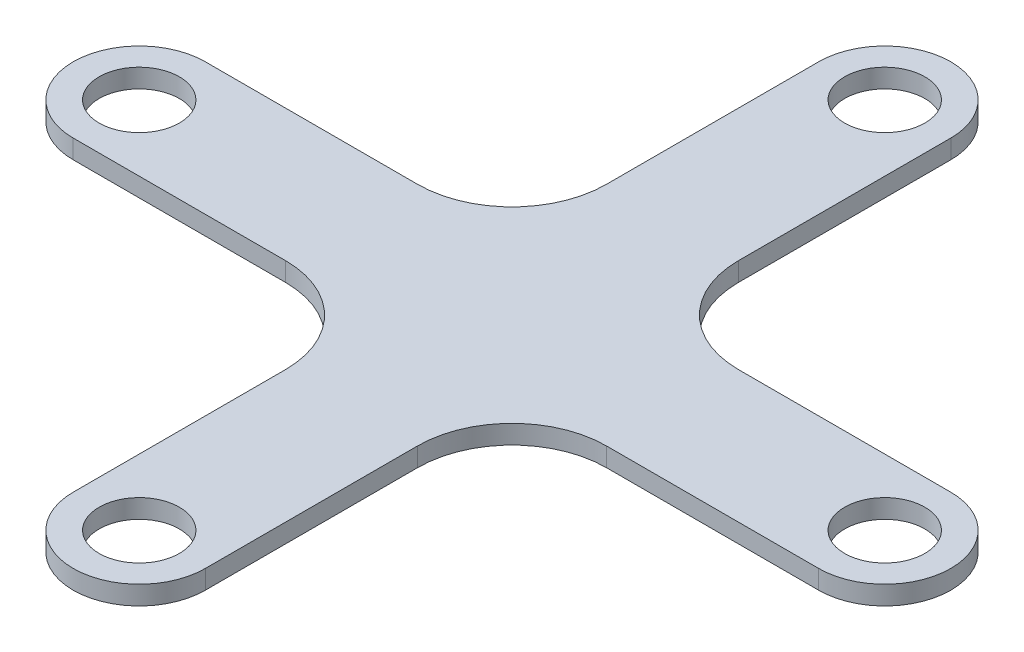
ISO-10303-21;
HEADER;
FILE_DESCRIPTION(('STEP AP214'),'2;1');
FILE_NAME('part.step','',(''),(''),'','','');
FILE_SCHEMA(('AUTOMOTIVE_DESIGN { 1 0 10303 214 1 1 1 1 }'));
ENDSEC;
DATA;
#1=APPLICATION_CONTEXT('core data for automotive mechanical design processes');
#2=APPLICATION_PROTOCOL_DEFINITION('international standard','automotive_design',2000,#1);
#3=PRODUCT_CONTEXT('',#1,'mechanical');
#4=PRODUCT('Part','Part','',(#3));
#5=PRODUCT_RELATED_PRODUCT_CATEGORY('part','',(#4));
#6=PRODUCT_DEFINITION_FORMATION('','',#4);
#7=PRODUCT_DEFINITION_CONTEXT('part definition',#1,'design');
#8=PRODUCT_DEFINITION('design','',#6,#7);
#9=PRODUCT_DEFINITION_SHAPE('','',#8);
#10=(LENGTH_UNIT() NAMED_UNIT(*) SI_UNIT(.MILLI.,.METRE.));
#11=(NAMED_UNIT(*) PLANE_ANGLE_UNIT() SI_UNIT($,.RADIAN.));
#12=(NAMED_UNIT(*) SI_UNIT($,.STERADIAN.) SOLID_ANGLE_UNIT());
#13=UNCERTAINTY_MEASURE_WITH_UNIT(LENGTH_MEASURE(1.E-05),#10,'distance_accuracy_value','');
#14=(GEOMETRIC_REPRESENTATION_CONTEXT(3) GLOBAL_UNCERTAINTY_ASSIGNED_CONTEXT((#13)) GLOBAL_UNIT_ASSIGNED_CONTEXT((#10,
#11,#12)) REPRESENTATION_CONTEXT('',''));
#15=CARTESIAN_POINT('',(0.,0.,0.));
#16=DIRECTION('',(0.,0.,1.));
#17=DIRECTION('',(1.,0.,0.));
#18=AXIS2_PLACEMENT_3D('',#15,#16,#17);
#19=CARTESIAN_POINT('',(-39.4999999999999,2.,2.55541280133494E-13));
#20=DIRECTION('',(0.,1.,0.));
#21=DIRECTION('',(0.,0.,1.));
#22=AXIS2_PLACEMENT_3D('',#19,#20,#21);
#23=PLANE('',#22);
#24=CARTESIAN_POINT('',(0.,2.,39.5000000000003));
#25=DIRECTION('',(0.,1.,0.));
#26=DIRECTION('',(0.,0.,1.));
#27=AXIS2_PLACEMENT_3D('',#24,#25,#26);
#28=CIRCLE('',#27,4.25);
#29=CARTESIAN_POINT('',(0.,2.,43.7500000000003));
#30=VERTEX_POINT('',#29);
#31=EDGE_CURVE('E343',#30,#30,#28,.T.);
#32=ORIENTED_EDGE('',*,*,#31,.F.);
#33=EDGE_LOOP('',(#32));
#34=FACE_BOUND('',#33,.T.);
#35=CARTESIAN_POINT('',(1.62016595972178E-13,2.,-39.4999999999997));
#36=DIRECTION('',(0.,1.,0.));
#37=DIRECTION('',(0.,0.,1.));
#38=AXIS2_PLACEMENT_3D('',#35,#36,#37);
#39=CIRCLE('',#38,4.25);
#40=CARTESIAN_POINT('',(1.62016595972178E-13,2.,-35.2499999999997));
#41=VERTEX_POINT('',#40);
#42=EDGE_CURVE('E182',#41,#41,#39,.T.);
#43=ORIENTED_EDGE('',*,*,#42,.F.);
#44=EDGE_LOOP('',(#43));
#45=FACE_BOUND('',#44,.T.);
#46=CARTESIAN_POINT('',(-39.4999999999999,2.,2.55541280133494E-13));
#47=DIRECTION('',(0.,1.,0.));
#48=DIRECTION('',(0.,0.,1.));
#49=AXIS2_PLACEMENT_3D('',#46,#47,#48);
#50=CIRCLE('',#49,7.00000000000001);
#51=CARTESIAN_POINT('',(-39.4999999999999,2.,-6.99999999999975));
#52=VERTEX_POINT('',#51);
#53=CARTESIAN_POINT('',(-39.4999999999999,2.,7.00000000000027));
#54=VERTEX_POINT('',#53);
#55=EDGE_CURVE('E209',#52,#54,#50,.T.);
#56=ORIENTED_EDGE('',*,*,#55,.T.);
#57=DIRECTION('',(1.,0.,0.));
#58=VECTOR('',#57,1.);
#59=CARTESIAN_POINT('',(-17.0000000000001,2.,7.00000000000043));
#60=LINE('',#59,#58);
#61=CARTESIAN_POINT('',(-17.0000000000001,2.,7.00000000000042));
#62=VERTEX_POINT('',#61);
#63=EDGE_CURVE('E117',#54,#62,#60,.T.);
#64=ORIENTED_EDGE('',*,*,#63,.T.);
#65=CARTESIAN_POINT('',(-17.0000000000001,2.,17.0000000000004));
#66=DIRECTION('',(0.,-1.,0.));
#67=DIRECTION('',(0.,0.,1.));
#68=AXIS2_PLACEMENT_3D('',#65,#66,#67);
#69=CIRCLE('',#68,10.);
#70=CARTESIAN_POINT('',(-7.00000000000005,2.,17.0000000000004));
#71=VERTEX_POINT('',#70);
#72=EDGE_CURVE('E248',#62,#71,#69,.T.);
#73=ORIENTED_EDGE('',*,*,#72,.T.);
#74=DIRECTION('',(0.,0.,1.));
#75=VECTOR('',#74,1.);
#76=CARTESIAN_POINT('',(-6.99999999999994,2.,39.5000000000003));
#77=LINE('',#76,#75);
#78=CARTESIAN_POINT('',(-6.99999999999995,2.,39.5000000000003));
#79=VERTEX_POINT('',#78);
#80=EDGE_CURVE('E267',#71,#79,#77,.T.);
#81=ORIENTED_EDGE('',*,*,#80,.T.);
#82=CARTESIAN_POINT('',(0.,2.,39.5000000000003));
#83=DIRECTION('',(0.,1.,0.));
#84=DIRECTION('',(0.,0.,1.));
#85=AXIS2_PLACEMENT_3D('',#82,#83,#84);
#86=CIRCLE('',#85,7.);
#87=CARTESIAN_POINT('',(7.00000000000007,2.,39.5000000000003));
#88=VERTEX_POINT('',#87);
#89=EDGE_CURVE('E264',#79,#88,#86,.T.);
#90=ORIENTED_EDGE('',*,*,#89,.T.);
#91=DIRECTION('',(0.,0.,-1.));
#92=VECTOR('',#91,1.);
#93=CARTESIAN_POINT('',(6.99999999999988,2.,17.0000000000006));
#94=LINE('',#93,#92);
#95=CARTESIAN_POINT('',(6.99999999999988,2.,17.0000000000006));
#96=VERTEX_POINT('',#95);
#97=EDGE_CURVE('E266',#88,#96,#94,.T.);
#98=ORIENTED_EDGE('',*,*,#97,.T.);
#99=CARTESIAN_POINT('',(16.9999999999999,2.,17.0000000000006));
#100=DIRECTION('',(0.,-1.,0.));
#101=DIRECTION('',(0.,0.,1.));
#102=AXIS2_PLACEMENT_3D('',#99,#100,#101);
#103=CIRCLE('',#102,10.);
#104=CARTESIAN_POINT('',(17.,2.,7.00000000000057));
#105=VERTEX_POINT('',#104);
#106=EDGE_CURVE('E269',#96,#105,#103,.T.);
#107=ORIENTED_EDGE('',*,*,#106,.T.);
#108=DIRECTION('',(1.,0.,0.));
#109=VECTOR('',#108,1.);
#110=CARTESIAN_POINT('',(39.5000000000001,2.,7.00000000000036));
#111=LINE('',#110,#109);
#112=CARTESIAN_POINT('',(39.5000000000001,2.,7.00000000000035));
#113=VERTEX_POINT('',#112);
#114=EDGE_CURVE('E275',#105,#113,#111,.T.);
#115=ORIENTED_EDGE('',*,*,#114,.T.);
#116=CARTESIAN_POINT('',(39.5000000000001,2.,3.48509305077733E-13));
#117=DIRECTION('',(0.,1.,0.));
#118=DIRECTION('',(0.,0.,1.));
#119=AXIS2_PLACEMENT_3D('',#116,#117,#118);
#120=CIRCLE('',#119,7.);
#121=CARTESIAN_POINT('',(39.5000000000001,2.,-6.99999999999965));
#122=VERTEX_POINT('',#121);
#123=EDGE_CURVE('E277',#113,#122,#120,.T.);
#124=ORIENTED_EDGE('',*,*,#123,.T.);
#125=DIRECTION('',(-1.,0.,0.));
#126=VECTOR('',#125,1.);
#127=CARTESIAN_POINT('',(17.0000000000006,2.,-6.99999999999994));
#128=LINE('',#127,#126);
#129=CARTESIAN_POINT('',(17.0000000000005,2.,-6.99999999999994));
#130=VERTEX_POINT('',#129);
#131=EDGE_CURVE('E279',#122,#130,#128,.T.);
#132=ORIENTED_EDGE('',*,*,#131,.T.);
#133=CARTESIAN_POINT('',(17.0000000000005,2.,-16.9999999999999));
#134=DIRECTION('',(0.,-1.,0.));
#135=DIRECTION('',(0.,0.,1.));
#136=AXIS2_PLACEMENT_3D('',#133,#134,#135);
#137=CIRCLE('',#136,10.);
#138=CARTESIAN_POINT('',(7.00000000000051,2.,-17.));
#139=VERTEX_POINT('',#138);
#140=EDGE_CURVE('E281',#130,#139,#137,.T.);
#141=ORIENTED_EDGE('',*,*,#140,.T.);
#142=DIRECTION('',(0.,0.,-1.));
#143=VECTOR('',#142,1.);
#144=CARTESIAN_POINT('',(7.00000000000016,2.,-39.4999999999997));
#145=LINE('',#144,#143);
#146=CARTESIAN_POINT('',(7.00000000000016,2.,-39.4999999999997));
#147=VERTEX_POINT('',#146);
#148=EDGE_CURVE('E283',#139,#147,#145,.T.);
#149=ORIENTED_EDGE('',*,*,#148,.T.);
#150=CARTESIAN_POINT('',(1.62016595972178E-13,2.,-39.4999999999997));
#151=DIRECTION('',(0.,1.,0.));
#152=DIRECTION('',(0.,0.,1.));
#153=AXIS2_PLACEMENT_3D('',#150,#151,#152);
#154=CIRCLE('',#153,7.);
#155=CARTESIAN_POINT('',(-6.99999999999984,2.,-39.4999999999997));
#156=VERTEX_POINT('',#155);
#157=EDGE_CURVE('E160',#147,#156,#154,.T.);
#158=ORIENTED_EDGE('',*,*,#157,.T.);
#159=DIRECTION('',(0.,0.,1.));
#160=VECTOR('',#159,1.);
#161=CARTESIAN_POINT('',(-7.,2.,-17.0000000000005));
#162=LINE('',#161,#160);
#163=CARTESIAN_POINT('',(-7.,2.,-17.0000000000005));
#164=VERTEX_POINT('',#163);
#165=EDGE_CURVE('E154',#156,#164,#162,.T.);
#166=ORIENTED_EDGE('',*,*,#165,.T.);
#167=CARTESIAN_POINT('',(-17.,2.,-16.9999999999999));
#168=DIRECTION('',(0.,-1.,0.));
#169=DIRECTION('',(0.,0.,1.));
#170=AXIS2_PLACEMENT_3D('',#167,#168,#169);
#171=CIRCLE('',#170,10.);
#172=CARTESIAN_POINT('',(-17.,2.,-6.99999999999987));
#173=VERTEX_POINT('',#172);
#174=EDGE_CURVE('E158',#164,#173,#171,.T.);
#175=ORIENTED_EDGE('',*,*,#174,.T.);
#176=DIRECTION('',(-1.,0.,0.));
#177=VECTOR('',#176,1.);
#178=CARTESIAN_POINT('',(-39.4999999999999,2.,-6.99999999999975));
#179=LINE('',#178,#177);
#180=EDGE_CURVE('E50',#173,#52,#179,.T.);
#181=ORIENTED_EDGE('',*,*,#180,.T.);
#182=EDGE_LOOP('',(#56,#64,#73,#81,#90,#98,#107,#115,#124,#132,#141,#149,#158,#166,#175,#181));
#183=FACE_BOUND('',#182,.T.);
#184=CARTESIAN_POINT('',(39.5000000000001,2.,3.48509305077733E-13));
#185=DIRECTION('',(0.,1.,0.));
#186=DIRECTION('',(0.,0.,1.));
#187=AXIS2_PLACEMENT_3D('',#184,#185,#186);
#188=CIRCLE('',#187,4.25);
#189=CARTESIAN_POINT('',(39.5000000000001,2.,4.25000000000035));
#190=VERTEX_POINT('',#189);
#191=EDGE_CURVE('E349',#190,#190,#188,.T.);
#192=ORIENTED_EDGE('',*,*,#191,.F.);
#193=EDGE_LOOP('',(#192));
#194=FACE_BOUND('',#193,.T.);
#195=CARTESIAN_POINT('',(-39.4999999999999,2.,2.55541280133494E-13));
#196=DIRECTION('',(0.,1.,0.));
#197=DIRECTION('',(0.,0.,1.));
#198=AXIS2_PLACEMENT_3D('',#195,#196,#197);
#199=CIRCLE('',#198,4.25000000000009);
#200=CARTESIAN_POINT('',(-39.4999999999999,2.,4.25000000000035));
#201=VERTEX_POINT('',#200);
#202=EDGE_CURVE('E334',#201,#201,#199,.T.);
#203=ORIENTED_EDGE('',*,*,#202,.F.);
#204=EDGE_LOOP('',(#203));
#205=FACE_BOUND('',#204,.T.);
#206=ADVANCED_FACE('F33',(#34,#45,#183,#194,#205),#23,.T.);
#207=CARTESIAN_POINT('',(-39.4999999999999,0.,2.55541280133494E-13));
#208=DIRECTION('',(0.,1.,0.));
#209=DIRECTION('',(0.,0.,1.));
#210=AXIS2_PLACEMENT_3D('',#207,#208,#209);
#211=PLANE('',#210);
#212=CARTESIAN_POINT('',(-39.4999999999999,0.,2.55541280133494E-13));
#213=DIRECTION('',(0.,1.,0.));
#214=DIRECTION('',(0.,0.,1.));
#215=AXIS2_PLACEMENT_3D('',#212,#213,#214);
#216=CIRCLE('',#215,7.00000000000001);
#217=CARTESIAN_POINT('',(-39.4999999999999,0.,-6.99999999999975));
#218=VERTEX_POINT('',#217);
#219=CARTESIAN_POINT('',(-39.4999999999999,0.,7.00000000000027));
#220=VERTEX_POINT('',#219);
#221=EDGE_CURVE('E178',#218,#220,#216,.T.);
#222=ORIENTED_EDGE('',*,*,#221,.F.);
#223=DIRECTION('',(-1.,0.,0.));
#224=VECTOR('',#223,1.);
#225=CARTESIAN_POINT('',(-39.4999999999999,0.,-6.99999999999975));
#226=LINE('',#225,#224);
#227=CARTESIAN_POINT('',(-17.,0.,-6.99999999999987));
#228=VERTEX_POINT('',#227);
#229=EDGE_CURVE('E109',#228,#218,#226,.T.);
#230=ORIENTED_EDGE('',*,*,#229,.F.);
#231=CARTESIAN_POINT('',(-17.,0.,-16.9999999999999));
#232=DIRECTION('',(0.,-1.,0.));
#233=DIRECTION('',(0.,0.,1.));
#234=AXIS2_PLACEMENT_3D('',#231,#232,#233);
#235=CIRCLE('',#234,10.);
#236=CARTESIAN_POINT('',(-7.,0.,-17.0000000000005));
#237=VERTEX_POINT('',#236);
#238=EDGE_CURVE('E103',#237,#228,#235,.T.);
#239=ORIENTED_EDGE('',*,*,#238,.F.);
#240=DIRECTION('',(0.,0.,1.));
#241=VECTOR('',#240,1.);
#242=CARTESIAN_POINT('',(-7.,0.,-17.0000000000005));
#243=LINE('',#242,#241);
#244=CARTESIAN_POINT('',(-6.99999999999984,0.,-39.4999999999997));
#245=VERTEX_POINT('',#244);
#246=EDGE_CURVE('E168',#245,#237,#243,.T.);
#247=ORIENTED_EDGE('',*,*,#246,.F.);
#248=CARTESIAN_POINT('',(1.62016595972178E-13,0.,-39.4999999999997));
#249=DIRECTION('',(0.,1.,0.));
#250=DIRECTION('',(0.,0.,1.));
#251=AXIS2_PLACEMENT_3D('',#248,#249,#250);
#252=CIRCLE('',#251,7.);
#253=CARTESIAN_POINT('',(7.00000000000016,0.,-39.4999999999997));
#254=VERTEX_POINT('',#253);
#255=EDGE_CURVE('E204',#254,#245,#252,.T.);
#256=ORIENTED_EDGE('',*,*,#255,.F.);
#257=DIRECTION('',(0.,0.,-1.));
#258=VECTOR('',#257,1.);
#259=CARTESIAN_POINT('',(7.00000000000016,0.,-39.4999999999997));
#260=LINE('',#259,#258);
#261=CARTESIAN_POINT('',(7.00000000000051,0.,-17.));
#262=VERTEX_POINT('',#261);
#263=EDGE_CURVE('E202',#262,#254,#260,.T.);
#264=ORIENTED_EDGE('',*,*,#263,.F.);
#265=CARTESIAN_POINT('',(17.0000000000005,0.,-16.9999999999999));
#266=DIRECTION('',(0.,-1.,0.));
#267=DIRECTION('',(0.,0.,1.));
#268=AXIS2_PLACEMENT_3D('',#265,#266,#267);
#269=CIRCLE('',#268,10.);
#270=CARTESIAN_POINT('',(17.0000000000005,0.,-6.99999999999994));
#271=VERTEX_POINT('',#270);
#272=EDGE_CURVE('E200',#271,#262,#269,.T.);
#273=ORIENTED_EDGE('',*,*,#272,.F.);
#274=DIRECTION('',(-1.,0.,0.));
#275=VECTOR('',#274,1.);
#276=CARTESIAN_POINT('',(17.0000000000006,0.,-6.99999999999994));
#277=LINE('',#276,#275);
#278=CARTESIAN_POINT('',(39.5000000000001,0.,-6.99999999999965));
#279=VERTEX_POINT('',#278);
#280=EDGE_CURVE('E198',#279,#271,#277,.T.);
#281=ORIENTED_EDGE('',*,*,#280,.F.);
#282=CARTESIAN_POINT('',(39.5000000000001,0.,3.48509305077733E-13));
#283=DIRECTION('',(0.,1.,0.));
#284=DIRECTION('',(0.,0.,1.));
#285=AXIS2_PLACEMENT_3D('',#282,#283,#284);
#286=CIRCLE('',#285,7.);
#287=CARTESIAN_POINT('',(39.5000000000001,0.,7.00000000000035));
#288=VERTEX_POINT('',#287);
#289=EDGE_CURVE('E196',#288,#279,#286,.T.);
#290=ORIENTED_EDGE('',*,*,#289,.F.);
#291=DIRECTION('',(1.,0.,0.));
#292=VECTOR('',#291,1.);
#293=CARTESIAN_POINT('',(39.5000000000001,0.,7.00000000000036));
#294=LINE('',#293,#292);
#295=CARTESIAN_POINT('',(17.,0.,7.00000000000057));
#296=VERTEX_POINT('',#295);
#297=EDGE_CURVE('E194',#296,#288,#294,.T.);
#298=ORIENTED_EDGE('',*,*,#297,.F.);
#299=CARTESIAN_POINT('',(16.9999999999999,0.,17.0000000000006));
#300=DIRECTION('',(0.,-1.,0.));
#301=DIRECTION('',(0.,0.,1.));
#302=AXIS2_PLACEMENT_3D('',#299,#300,#301);
#303=CIRCLE('',#302,10.);
#304=CARTESIAN_POINT('',(6.99999999999988,0.,17.0000000000006));
#305=VERTEX_POINT('',#304);
#306=EDGE_CURVE('E192',#305,#296,#303,.T.);
#307=ORIENTED_EDGE('',*,*,#306,.F.);
#308=DIRECTION('',(0.,0.,-1.));
#309=VECTOR('',#308,1.);
#310=CARTESIAN_POINT('',(6.99999999999988,0.,17.0000000000006));
#311=LINE('',#310,#309);
#312=CARTESIAN_POINT('',(7.00000000000007,0.,39.5000000000003));
#313=VERTEX_POINT('',#312);
#314=EDGE_CURVE('E190',#313,#305,#311,.T.);
#315=ORIENTED_EDGE('',*,*,#314,.F.);
#316=CARTESIAN_POINT('',(0.,0.,39.5000000000003));
#317=DIRECTION('',(0.,1.,0.));
#318=DIRECTION('',(0.,0.,1.));
#319=AXIS2_PLACEMENT_3D('',#316,#317,#318);
#320=CIRCLE('',#319,7.);
#321=CARTESIAN_POINT('',(-6.99999999999995,0.,39.5000000000003));
#322=VERTEX_POINT('',#321);
#323=EDGE_CURVE('E188',#322,#313,#320,.T.);
#324=ORIENTED_EDGE('',*,*,#323,.F.);
#325=DIRECTION('',(0.,0.,1.));
#326=VECTOR('',#325,1.);
#327=CARTESIAN_POINT('',(-6.99999999999994,0.,39.5000000000003));
#328=LINE('',#327,#326);
#329=CARTESIAN_POINT('',(-7.00000000000005,0.,17.0000000000004));
#330=VERTEX_POINT('',#329);
#331=EDGE_CURVE('E186',#330,#322,#328,.T.);
#332=ORIENTED_EDGE('',*,*,#331,.F.);
#333=CARTESIAN_POINT('',(-17.0000000000001,0.,17.0000000000004));
#334=DIRECTION('',(0.,-1.,0.));
#335=DIRECTION('',(0.,0.,1.));
#336=AXIS2_PLACEMENT_3D('',#333,#334,#335);
#337=CIRCLE('',#336,10.);
#338=CARTESIAN_POINT('',(-17.0000000000001,0.,7.00000000000042));
#339=VERTEX_POINT('',#338);
#340=EDGE_CURVE('E184',#339,#330,#337,.T.);
#341=ORIENTED_EDGE('',*,*,#340,.F.);
#342=DIRECTION('',(1.,0.,0.));
#343=VECTOR('',#342,1.);
#344=CARTESIAN_POINT('',(-17.0000000000001,0.,7.00000000000043));
#345=LINE('',#344,#343);
#346=EDGE_CURVE('E181',#220,#339,#345,.T.);
#347=ORIENTED_EDGE('',*,*,#346,.F.);
#348=EDGE_LOOP('',(#222,#230,#239,#247,#256,#264,#273,#281,#290,#298,#307,#315,#324,#332,#341,#347));
#349=FACE_BOUND('',#348,.T.);
#350=CARTESIAN_POINT('',(1.62016595972178E-13,0.,-39.4999999999997));
#351=DIRECTION('',(0.,1.,0.));
#352=DIRECTION('',(0.,0.,1.));
#353=AXIS2_PLACEMENT_3D('',#350,#351,#352);
#354=CIRCLE('',#353,4.25);
#355=CARTESIAN_POINT('',(1.62016595972178E-13,0.,-35.2499999999997));
#356=VERTEX_POINT('',#355);
#357=EDGE_CURVE('E352',#356,#356,#354,.T.);
#358=ORIENTED_EDGE('',*,*,#357,.T.);
#359=EDGE_LOOP('',(#358));
#360=FACE_BOUND('',#359,.T.);
#361=CARTESIAN_POINT('',(39.5000000000001,0.,3.48509305077733E-13));
#362=DIRECTION('',(0.,1.,0.));
#363=DIRECTION('',(0.,0.,1.));
#364=AXIS2_PLACEMENT_3D('',#361,#362,#363);
#365=CIRCLE('',#364,4.25);
#366=CARTESIAN_POINT('',(39.5000000000001,0.,4.25000000000035));
#367=VERTEX_POINT('',#366);
#368=EDGE_CURVE('E346',#367,#367,#365,.T.);
#369=ORIENTED_EDGE('',*,*,#368,.T.);
#370=EDGE_LOOP('',(#369));
#371=FACE_BOUND('',#370,.T.);
#372=CARTESIAN_POINT('',(0.,0.,39.5000000000003));
#373=DIRECTION('',(0.,1.,0.));
#374=DIRECTION('',(0.,0.,1.));
#375=AXIS2_PLACEMENT_3D('',#372,#373,#374);
#376=CIRCLE('',#375,4.25);
#377=CARTESIAN_POINT('',(0.,0.,43.7500000000003));
#378=VERTEX_POINT('',#377);
#379=EDGE_CURVE('E340',#378,#378,#376,.T.);
#380=ORIENTED_EDGE('',*,*,#379,.T.);
#381=EDGE_LOOP('',(#380));
#382=FACE_BOUND('',#381,.T.);
#383=CARTESIAN_POINT('',(-39.4999999999999,0.,2.55541280133494E-13));
#384=DIRECTION('',(0.,1.,0.));
#385=DIRECTION('',(0.,0.,1.));
#386=AXIS2_PLACEMENT_3D('',#383,#384,#385);
#387=CIRCLE('',#386,4.25000000000009);
#388=CARTESIAN_POINT('',(-39.4999999999999,0.,4.25000000000035));
#389=VERTEX_POINT('',#388);
#390=EDGE_CURVE('E337',#389,#389,#387,.T.);
#391=ORIENTED_EDGE('',*,*,#390,.T.);
#392=EDGE_LOOP('',(#391));
#393=FACE_BOUND('',#392,.T.);
#394=ADVANCED_FACE('F252',(#349,#360,#371,#382,#393),#211,.F.);
#395=CARTESIAN_POINT('',(-39.4999999999999,2.,2.55541280133494E-13));
#396=DIRECTION('',(0.,-1.,0.));
#397=DIRECTION('',(0.,0.,-1.));
#398=AXIS2_PLACEMENT_3D('',#395,#396,#397);
#399=CYLINDRICAL_SURFACE('',#398,7.00000000000001);
#400=ORIENTED_EDGE('',*,*,#221,.T.);
#401=DIRECTION('',(0.,-1.,0.));
#402=VECTOR('',#401,1.);
#403=CARTESIAN_POINT('',(-39.4999999999999,2.,7.00000000000027));
#404=LINE('',#403,#402);
#405=EDGE_CURVE('E11',#54,#220,#404,.T.);
#406=ORIENTED_EDGE('',*,*,#405,.F.);
#407=ORIENTED_EDGE('',*,*,#55,.F.);
#408=DIRECTION('',(0.,-1.,0.));
#409=VECTOR('',#408,1.);
#410=CARTESIAN_POINT('',(-39.4999999999999,2.,-6.99999999999975));
#411=LINE('',#410,#409);
#412=EDGE_CURVE('E174',#52,#218,#411,.T.);
#413=ORIENTED_EDGE('',*,*,#412,.T.);
#414=EDGE_LOOP('',(#400,#406,#407,#413));
#415=FACE_BOUND('',#414,.T.);
#416=ADVANCED_FACE('F35',(#415),#399,.T.);
#417=CARTESIAN_POINT('',(-17.0000000000001,2.,7.00000000000043));
#418=DIRECTION('',(0.,0.,-1.));
#419=DIRECTION('',(-1.,0.,0.));
#420=AXIS2_PLACEMENT_3D('',#417,#418,#419);
#421=PLANE('',#420);
#422=ORIENTED_EDGE('',*,*,#346,.T.);
#423=DIRECTION('',(0.,-1.,0.));
#424=VECTOR('',#423,1.);
#425=CARTESIAN_POINT('',(-17.0000000000001,2.,7.00000000000042));
#426=LINE('',#425,#424);
#427=EDGE_CURVE('E42',#62,#339,#426,.T.);
#428=ORIENTED_EDGE('',*,*,#427,.F.);
#429=ORIENTED_EDGE('',*,*,#63,.F.);
#430=ORIENTED_EDGE('',*,*,#405,.T.);
#431=EDGE_LOOP('',(#422,#428,#429,#430));
#432=FACE_BOUND('',#431,.T.);
#433=ADVANCED_FACE('F502',(#432),#421,.F.);
#434=CARTESIAN_POINT('',(-17.0000000000001,2.,17.0000000000004));
#435=DIRECTION('',(0.,-1.,0.));
#436=DIRECTION('',(0.,0.,-1.));
#437=AXIS2_PLACEMENT_3D('',#434,#435,#436);
#438=CYLINDRICAL_SURFACE('',#437,10.);
#439=ORIENTED_EDGE('',*,*,#340,.T.);
#440=DIRECTION('',(0.,-1.,0.));
#441=VECTOR('',#440,1.);
#442=CARTESIAN_POINT('',(-7.00000000000005,2.,17.0000000000004));
#443=LINE('',#442,#441);
#444=EDGE_CURVE('E240',#71,#330,#443,.T.);
#445=ORIENTED_EDGE('',*,*,#444,.F.);
#446=ORIENTED_EDGE('',*,*,#72,.F.);
#447=ORIENTED_EDGE('',*,*,#427,.T.);
#448=EDGE_LOOP('',(#439,#445,#446,#447));
#449=FACE_BOUND('',#448,.T.);
#450=ADVANCED_FACE('F246',(#449),#438,.F.);
#451=CARTESIAN_POINT('',(-6.99999999999994,2.,39.5000000000003));
#452=DIRECTION('',(1.,0.,0.));
#453=DIRECTION('',(0.,0.,-1.));
#454=AXIS2_PLACEMENT_3D('',#451,#452,#453);
#455=PLANE('',#454);
#456=ORIENTED_EDGE('',*,*,#331,.T.);
#457=DIRECTION('',(0.,-1.,0.));
#458=VECTOR('',#457,1.);
#459=CARTESIAN_POINT('',(-6.99999999999995,2.,39.5000000000003));
#460=LINE('',#459,#458);
#461=EDGE_CURVE('E237',#79,#322,#460,.T.);
#462=ORIENTED_EDGE('',*,*,#461,.F.);
#463=ORIENTED_EDGE('',*,*,#80,.F.);
#464=ORIENTED_EDGE('',*,*,#444,.T.);
#465=EDGE_LOOP('',(#456,#462,#463,#464));
#466=FACE_BOUND('',#465,.T.);
#467=ADVANCED_FACE('F258',(#466),#455,.F.);
#468=CARTESIAN_POINT('',(0.,2.,39.5000000000003));
#469=DIRECTION('',(0.,-1.,0.));
#470=DIRECTION('',(0.,0.,-1.));
#471=AXIS2_PLACEMENT_3D('',#468,#469,#470);
#472=CYLINDRICAL_SURFACE('',#471,7.);
#473=ORIENTED_EDGE('',*,*,#323,.T.);
#474=DIRECTION('',(0.,-1.,0.));
#475=VECTOR('',#474,1.);
#476=CARTESIAN_POINT('',(7.00000000000007,2.,39.5000000000003));
#477=LINE('',#476,#475);
#478=EDGE_CURVE('E234',#88,#313,#477,.T.);
#479=ORIENTED_EDGE('',*,*,#478,.F.);
#480=ORIENTED_EDGE('',*,*,#89,.F.);
#481=ORIENTED_EDGE('',*,*,#461,.T.);
#482=EDGE_LOOP('',(#473,#479,#480,#481));
#483=FACE_BOUND('',#482,.T.);
#484=ADVANCED_FACE('F262',(#483),#472,.T.);
#485=CARTESIAN_POINT('',(6.99999999999988,2.,17.0000000000006));
#486=DIRECTION('',(-1.,0.,0.));
#487=DIRECTION('',(0.,0.,1.));
#488=AXIS2_PLACEMENT_3D('',#485,#486,#487);
#489=PLANE('',#488);
#490=ORIENTED_EDGE('',*,*,#314,.T.);
#491=DIRECTION('',(0.,-1.,0.));
#492=VECTOR('',#491,1.);
#493=CARTESIAN_POINT('',(6.99999999999988,2.,17.0000000000006));
#494=LINE('',#493,#492);
#495=EDGE_CURVE('E231',#96,#305,#494,.T.);
#496=ORIENTED_EDGE('',*,*,#495,.F.);
#497=ORIENTED_EDGE('',*,*,#97,.F.);
#498=ORIENTED_EDGE('',*,*,#478,.T.);
#499=EDGE_LOOP('',(#490,#496,#497,#498));
#500=FACE_BOUND('',#499,.T.);
#501=ADVANCED_FACE('F467',(#500),#489,.F.);
#502=CARTESIAN_POINT('',(16.9999999999999,2.,17.0000000000006));
#503=DIRECTION('',(0.,-1.,0.));
#504=DIRECTION('',(0.,0.,-1.));
#505=AXIS2_PLACEMENT_3D('',#502,#503,#504);
#506=CYLINDRICAL_SURFACE('',#505,10.);
#507=ORIENTED_EDGE('',*,*,#306,.T.);
#508=DIRECTION('',(0.,-1.,0.));
#509=VECTOR('',#508,1.);
#510=CARTESIAN_POINT('',(17.,2.,7.00000000000057));
#511=LINE('',#510,#509);
#512=EDGE_CURVE('E228',#105,#296,#511,.T.);
#513=ORIENTED_EDGE('',*,*,#512,.F.);
#514=ORIENTED_EDGE('',*,*,#106,.F.);
#515=ORIENTED_EDGE('',*,*,#495,.T.);
#516=EDGE_LOOP('',(#507,#513,#514,#515));
#517=FACE_BOUND('',#516,.T.);
#518=ADVANCED_FACE('F457',(#517),#506,.F.);
#519=CARTESIAN_POINT('',(39.5000000000001,2.,7.00000000000036));
#520=DIRECTION('',(0.,0.,-1.));
#521=DIRECTION('',(-1.,0.,0.));
#522=AXIS2_PLACEMENT_3D('',#519,#520,#521);
#523=PLANE('',#522);
#524=ORIENTED_EDGE('',*,*,#297,.T.);
#525=DIRECTION('',(0.,-1.,0.));
#526=VECTOR('',#525,1.);
#527=CARTESIAN_POINT('',(39.5000000000001,2.,7.00000000000035));
#528=LINE('',#527,#526);
#529=EDGE_CURVE('E225',#113,#288,#528,.T.);
#530=ORIENTED_EDGE('',*,*,#529,.F.);
#531=ORIENTED_EDGE('',*,*,#114,.F.);
#532=ORIENTED_EDGE('',*,*,#512,.T.);
#533=EDGE_LOOP('',(#524,#530,#531,#532));
#534=FACE_BOUND('',#533,.T.);
#535=ADVANCED_FACE('F447',(#534),#523,.F.);
#536=CARTESIAN_POINT('',(39.5000000000001,2.,3.48509305077733E-13));
#537=DIRECTION('',(0.,-1.,0.));
#538=DIRECTION('',(0.,0.,-1.));
#539=AXIS2_PLACEMENT_3D('',#536,#537,#538);
#540=CYLINDRICAL_SURFACE('',#539,7.);
#541=ORIENTED_EDGE('',*,*,#289,.T.);
#542=DIRECTION('',(0.,-1.,0.));
#543=VECTOR('',#542,1.);
#544=CARTESIAN_POINT('',(39.5000000000001,2.,-6.99999999999965));
#545=LINE('',#544,#543);
#546=EDGE_CURVE('E222',#122,#279,#545,.T.);
#547=ORIENTED_EDGE('',*,*,#546,.F.);
#548=ORIENTED_EDGE('',*,*,#123,.F.);
#549=ORIENTED_EDGE('',*,*,#529,.T.);
#550=EDGE_LOOP('',(#541,#547,#548,#549));
#551=FACE_BOUND('',#550,.T.);
#552=ADVANCED_FACE('F437',(#551),#540,.T.);
#553=CARTESIAN_POINT('',(17.0000000000006,2.,-6.99999999999994));
#554=DIRECTION('',(0.,0.,1.));
#555=DIRECTION('',(1.,0.,0.));
#556=AXIS2_PLACEMENT_3D('',#553,#554,#555);
#557=PLANE('',#556);
#558=ORIENTED_EDGE('',*,*,#280,.T.);
#559=DIRECTION('',(0.,-1.,0.));
#560=VECTOR('',#559,1.);
#561=CARTESIAN_POINT('',(17.0000000000005,2.,-6.99999999999994));
#562=LINE('',#561,#560);
#563=EDGE_CURVE('E219',#130,#271,#562,.T.);
#564=ORIENTED_EDGE('',*,*,#563,.F.);
#565=ORIENTED_EDGE('',*,*,#131,.F.);
#566=ORIENTED_EDGE('',*,*,#546,.T.);
#567=EDGE_LOOP('',(#558,#564,#565,#566));
#568=FACE_BOUND('',#567,.T.);
#569=ADVANCED_FACE('F427',(#568),#557,.F.);
#570=CARTESIAN_POINT('',(17.0000000000005,2.,-16.9999999999999));
#571=DIRECTION('',(0.,-1.,0.));
#572=DIRECTION('',(0.,0.,-1.));
#573=AXIS2_PLACEMENT_3D('',#570,#571,#572);
#574=CYLINDRICAL_SURFACE('',#573,10.);
#575=ORIENTED_EDGE('',*,*,#272,.T.);
#576=DIRECTION('',(0.,-1.,0.));
#577=VECTOR('',#576,1.);
#578=CARTESIAN_POINT('',(7.00000000000051,2.,-17.));
#579=LINE('',#578,#577);
#580=EDGE_CURVE('E216',#139,#262,#579,.T.);
#581=ORIENTED_EDGE('',*,*,#580,.F.);
#582=ORIENTED_EDGE('',*,*,#140,.F.);
#583=ORIENTED_EDGE('',*,*,#563,.T.);
#584=EDGE_LOOP('',(#575,#581,#582,#583));
#585=FACE_BOUND('',#584,.T.);
#586=ADVANCED_FACE('F418',(#585),#574,.F.);
#587=CARTESIAN_POINT('',(7.00000000000016,2.,-39.4999999999997));
#588=DIRECTION('',(-1.,0.,0.));
#589=DIRECTION('',(0.,0.,1.));
#590=AXIS2_PLACEMENT_3D('',#587,#588,#589);
#591=PLANE('',#590);
#592=ORIENTED_EDGE('',*,*,#263,.T.);
#593=DIRECTION('',(0.,-1.,0.));
#594=VECTOR('',#593,1.);
#595=CARTESIAN_POINT('',(7.00000000000016,2.,-39.4999999999997));
#596=LINE('',#595,#594);
#597=EDGE_CURVE('E213',#147,#254,#596,.T.);
#598=ORIENTED_EDGE('',*,*,#597,.F.);
#599=ORIENTED_EDGE('',*,*,#148,.F.);
#600=ORIENTED_EDGE('',*,*,#580,.T.);
#601=EDGE_LOOP('',(#592,#598,#599,#600));
#602=FACE_BOUND('',#601,.T.);
#603=ADVANCED_FACE('F289',(#602),#591,.F.);
#604=CARTESIAN_POINT('',(1.62016595972178E-13,2.,-39.4999999999997));
#605=DIRECTION('',(0.,-1.,0.));
#606=DIRECTION('',(0.,0.,-1.));
#607=AXIS2_PLACEMENT_3D('',#604,#605,#606);
#608=CYLINDRICAL_SURFACE('',#607,7.);
#609=ORIENTED_EDGE('',*,*,#255,.T.);
#610=DIRECTION('',(0.,-1.,0.));
#611=VECTOR('',#610,1.);
#612=CARTESIAN_POINT('',(-6.99999999999984,2.,-39.4999999999997));
#613=LINE('',#612,#611);
#614=EDGE_CURVE('E169',#156,#245,#613,.T.);
#615=ORIENTED_EDGE('',*,*,#614,.F.);
#616=ORIENTED_EDGE('',*,*,#157,.F.);
#617=ORIENTED_EDGE('',*,*,#597,.T.);
#618=EDGE_LOOP('',(#609,#615,#616,#617));
#619=FACE_BOUND('',#618,.T.);
#620=ADVANCED_FACE('F293',(#619),#608,.T.);
#621=CARTESIAN_POINT('',(-7.,2.,-17.0000000000005));
#622=DIRECTION('',(1.,0.,0.));
#623=DIRECTION('',(0.,0.,-1.));
#624=AXIS2_PLACEMENT_3D('',#621,#622,#623);
#625=PLANE('',#624);
#626=ORIENTED_EDGE('',*,*,#246,.T.);
#627=DIRECTION('',(0.,-1.,0.));
#628=VECTOR('',#627,1.);
#629=CARTESIAN_POINT('',(-7.,2.,-17.0000000000005));
#630=LINE('',#629,#628);
#631=EDGE_CURVE('E165',#164,#237,#630,.T.);
#632=ORIENTED_EDGE('',*,*,#631,.F.);
#633=ORIENTED_EDGE('',*,*,#165,.F.);
#634=ORIENTED_EDGE('',*,*,#614,.T.);
#635=EDGE_LOOP('',(#626,#632,#633,#634));
#636=FACE_BOUND('',#635,.T.);
#637=ADVANCED_FACE('F166',(#636),#625,.F.);
#638=CARTESIAN_POINT('',(-17.,2.,-16.9999999999999));
#639=DIRECTION('',(0.,-1.,0.));
#640=DIRECTION('',(0.,0.,-1.));
#641=AXIS2_PLACEMENT_3D('',#638,#639,#640);
#642=CYLINDRICAL_SURFACE('',#641,10.);
#643=ORIENTED_EDGE('',*,*,#238,.T.);
#644=DIRECTION('',(0.,-1.,0.));
#645=VECTOR('',#644,1.);
#646=CARTESIAN_POINT('',(-17.,2.,-6.99999999999987));
#647=LINE('',#646,#645);
#648=EDGE_CURVE('E170',#173,#228,#647,.T.);
#649=ORIENTED_EDGE('',*,*,#648,.F.);
#650=ORIENTED_EDGE('',*,*,#174,.F.);
#651=ORIENTED_EDGE('',*,*,#631,.T.);
#652=EDGE_LOOP('',(#643,#649,#650,#651));
#653=FACE_BOUND('',#652,.T.);
#654=ADVANCED_FACE('F172',(#653),#642,.F.);
#655=CARTESIAN_POINT('',(-39.4999999999999,2.,-6.99999999999975));
#656=DIRECTION('',(0.,0.,1.));
#657=DIRECTION('',(1.,0.,0.));
#658=AXIS2_PLACEMENT_3D('',#655,#656,#657);
#659=PLANE('',#658);
#660=ORIENTED_EDGE('',*,*,#229,.T.);
#661=ORIENTED_EDGE('',*,*,#412,.F.);
#662=ORIENTED_EDGE('',*,*,#180,.F.);
#663=ORIENTED_EDGE('',*,*,#648,.T.);
#664=EDGE_LOOP('',(#660,#661,#662,#663));
#665=FACE_BOUND('',#664,.T.);
#666=ADVANCED_FACE('F297',(#665),#659,.F.);
#667=CARTESIAN_POINT('',(1.62016595972178E-13,2.,-39.4999999999997));
#668=DIRECTION('',(0.,-1.,0.));
#669=DIRECTION('',(0.,0.,-1.));
#670=AXIS2_PLACEMENT_3D('',#667,#668,#669);
#671=CYLINDRICAL_SURFACE('',#670,4.25);
#672=ORIENTED_EDGE('',*,*,#42,.T.);
#673=EDGE_LOOP('',(#672));
#674=FACE_BOUND('',#673,.T.);
#675=ORIENTED_EDGE('',*,*,#357,.F.);
#676=EDGE_LOOP('',(#675));
#677=FACE_BOUND('',#676,.T.);
#678=ADVANCED_FACE('F299',(#674,#677),#671,.F.);
#679=CARTESIAN_POINT('',(39.5000000000001,2.,3.48509305077733E-13));
#680=DIRECTION('',(0.,-1.,0.));
#681=DIRECTION('',(0.,0.,-1.));
#682=AXIS2_PLACEMENT_3D('',#679,#680,#681);
#683=CYLINDRICAL_SURFACE('',#682,4.25);
#684=ORIENTED_EDGE('',*,*,#191,.T.);
#685=EDGE_LOOP('',(#684));
#686=FACE_BOUND('',#685,.T.);
#687=ORIENTED_EDGE('',*,*,#368,.F.);
#688=EDGE_LOOP('',(#687));
#689=FACE_BOUND('',#688,.T.);
#690=ADVANCED_FACE('F305',(#686,#689),#683,.F.);
#691=CARTESIAN_POINT('',(0.,2.,39.5000000000003));
#692=DIRECTION('',(0.,-1.,0.));
#693=DIRECTION('',(0.,0.,-1.));
#694=AXIS2_PLACEMENT_3D('',#691,#692,#693);
#695=CYLINDRICAL_SURFACE('',#694,4.25);
#696=ORIENTED_EDGE('',*,*,#31,.T.);
#697=EDGE_LOOP('',(#696));
#698=FACE_BOUND('',#697,.T.);
#699=ORIENTED_EDGE('',*,*,#379,.F.);
#700=EDGE_LOOP('',(#699));
#701=FACE_BOUND('',#700,.T.);
#702=ADVANCED_FACE('F321',(#698,#701),#695,.F.);
#703=CARTESIAN_POINT('',(-39.4999999999999,2.,2.55541280133494E-13));
#704=DIRECTION('',(0.,-1.,0.));
#705=DIRECTION('',(0.,0.,-1.));
#706=AXIS2_PLACEMENT_3D('',#703,#704,#705);
#707=CYLINDRICAL_SURFACE('',#706,4.25000000000009);
#708=ORIENTED_EDGE('',*,*,#202,.T.);
#709=EDGE_LOOP('',(#708));
#710=FACE_BOUND('',#709,.T.);
#711=ORIENTED_EDGE('',*,*,#390,.F.);
#712=EDGE_LOOP('',(#711));
#713=FACE_BOUND('',#712,.T.);
#714=ADVANCED_FACE('F325',(#710,#713),#707,.F.);
#715=CLOSED_SHELL('',(#206,#394,#416,#433,#450,#467,#484,#501,#518,#535,#552,#569,#586,#603,
#620,#637,#654,#666,#678,#690,#702,#714));
#716=MANIFOLD_SOLID_BREP('B2',#715);
#717=ADVANCED_BREP_SHAPE_REPRESENTATION('',(#18,#716),#14);
#718=SHAPE_DEFINITION_REPRESENTATION(#9,#717);
ENDSEC;
END-ISO-10303-21;
